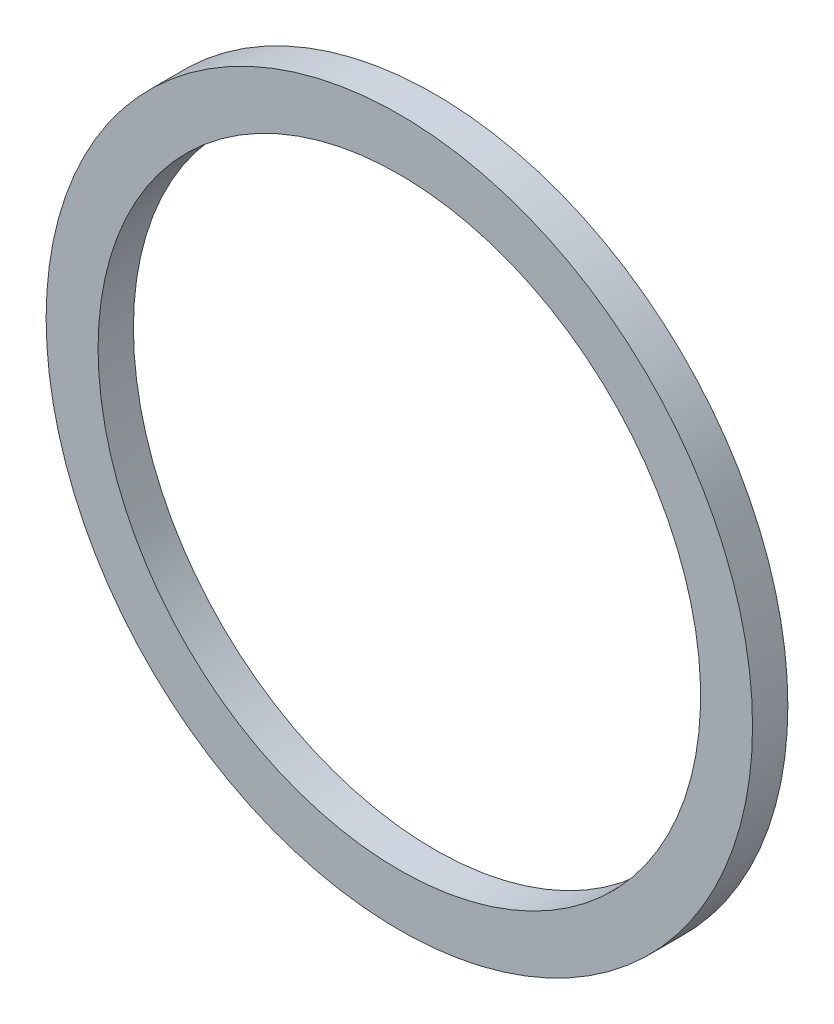
ISO-10303-21;
HEADER;
FILE_DESCRIPTION(('STEP AP214'),'2;1');
FILE_NAME('part.step','',(''),(''),'','','');
FILE_SCHEMA(('AUTOMOTIVE_DESIGN { 1 0 10303 214 1 1 1 1 }'));
ENDSEC;
DATA;
#1=APPLICATION_CONTEXT('core data for automotive mechanical design processes');
#2=APPLICATION_PROTOCOL_DEFINITION('international standard','automotive_design',2000,#1);
#3=PRODUCT_CONTEXT('',#1,'mechanical');
#4=PRODUCT('Part','Part','',(#3));
#5=PRODUCT_RELATED_PRODUCT_CATEGORY('part','',(#4));
#6=PRODUCT_DEFINITION_FORMATION('','',#4);
#7=PRODUCT_DEFINITION_CONTEXT('part definition',#1,'design');
#8=PRODUCT_DEFINITION('design','',#6,#7);
#9=PRODUCT_DEFINITION_SHAPE('','',#8);
#10=(LENGTH_UNIT() NAMED_UNIT(*) SI_UNIT(.MILLI.,.METRE.));
#11=(NAMED_UNIT(*) PLANE_ANGLE_UNIT() SI_UNIT($,.RADIAN.));
#12=(NAMED_UNIT(*) SI_UNIT($,.STERADIAN.) SOLID_ANGLE_UNIT());
#13=UNCERTAINTY_MEASURE_WITH_UNIT(LENGTH_MEASURE(1.E-05),#10,'distance_accuracy_value','');
#14=(GEOMETRIC_REPRESENTATION_CONTEXT(3) GLOBAL_UNCERTAINTY_ASSIGNED_CONTEXT((#13)) GLOBAL_UNIT_ASSIGNED_CONTEXT((#10,
#11,#12)) REPRESENTATION_CONTEXT('',''));
#15=CARTESIAN_POINT('',(0.,0.,0.));
#16=DIRECTION('',(0.,0.,1.));
#17=DIRECTION('',(1.,0.,0.));
#18=AXIS2_PLACEMENT_3D('',#15,#16,#17);
#19=CARTESIAN_POINT('',(0.,0.,3.39999999999996));
#20=DIRECTION('',(0.,0.,0.999999999999999));
#21=DIRECTION('',(1.,0.,0.));
#22=AXIS2_PLACEMENT_3D('',#19,#20,#21);
#23=PLANE('',#22);
#24=CARTESIAN_POINT('',(0.,0.,3.39999999999996));
#25=DIRECTION('',(0.,0.,0.999999999999999));
#26=DIRECTION('',(1.,0.,0.));
#27=AXIS2_PLACEMENT_3D('',#24,#25,#26);
#28=CIRCLE('',#27,34.);
#29=CARTESIAN_POINT('',(-34.,0.,3.39999999999996));
#30=VERTEX_POINT('',#29);
#31=EDGE_CURVE('E10',#30,#30,#28,.T.);
#32=ORIENTED_EDGE('',*,*,#31,.T.);
#33=EDGE_LOOP('',(#32));
#34=FACE_BOUND('',#33,.T.);
#35=CARTESIAN_POINT('',(0.,0.,3.39999999999996));
#36=DIRECTION('',(0.,0.,0.999999999999999));
#37=DIRECTION('',(1.,0.,0.));
#38=AXIS2_PLACEMENT_3D('',#35,#36,#37);
#39=CIRCLE('',#38,29.);
#40=CARTESIAN_POINT('',(-29.,0.,3.39999999999996));
#41=VERTEX_POINT('',#40);
#42=EDGE_CURVE('E43',#41,#41,#39,.T.);
#43=ORIENTED_EDGE('',*,*,#42,.F.);
#44=EDGE_LOOP('',(#43));
#45=FACE_BOUND('',#44,.T.);
#46=ADVANCED_FACE('F32',(#34,#45),#23,.T.);
#47=CARTESIAN_POINT('',(0.,0.,0.));
#48=DIRECTION('',(0.,0.,0.999999999999999));
#49=DIRECTION('',(1.,0.,0.));
#50=AXIS2_PLACEMENT_3D('',#47,#48,#49);
#51=PLANE('',#50);
#52=CARTESIAN_POINT('',(0.,0.,0.));
#53=DIRECTION('',(0.,0.,0.999999999999999));
#54=DIRECTION('',(1.,0.,0.));
#55=AXIS2_PLACEMENT_3D('',#52,#53,#54);
#56=CIRCLE('',#55,34.);
#57=CARTESIAN_POINT('',(-34.,0.,0.));
#58=VERTEX_POINT('',#57);
#59=EDGE_CURVE('E36',#58,#58,#56,.T.);
#60=ORIENTED_EDGE('',*,*,#59,.F.);
#61=EDGE_LOOP('',(#60));
#62=FACE_BOUND('',#61,.T.);
#63=CARTESIAN_POINT('',(0.,0.,0.));
#64=DIRECTION('',(0.,0.,0.999999999999999));
#65=DIRECTION('',(1.,0.,0.));
#66=AXIS2_PLACEMENT_3D('',#63,#64,#65);
#67=CIRCLE('',#66,29.);
#68=CARTESIAN_POINT('',(-29.,0.,0.));
#69=VERTEX_POINT('',#68);
#70=EDGE_CURVE('E45',#69,#69,#67,.T.);
#71=ORIENTED_EDGE('',*,*,#70,.T.);
#72=EDGE_LOOP('',(#71));
#73=FACE_BOUND('',#72,.T.);
#74=ADVANCED_FACE('F55',(#62,#73),#51,.F.);
#75=CARTESIAN_POINT('',(0.,0.,3.39999999999996));
#76=DIRECTION('',(0.,0.,-0.999999999999999));
#77=DIRECTION('',(-1.,0.,0.));
#78=AXIS2_PLACEMENT_3D('',#75,#76,#77);
#79=CYLINDRICAL_SURFACE('',#78,34.);
#80=CARTESIAN_POINT('',(-34.,0.,3.39999999999996));
#81=CARTESIAN_POINT('',(-34.,0.,3.36458333333329));
#82=CARTESIAN_POINT('',(-34.,0.,3.32916666666663));
#83=CARTESIAN_POINT('',(-34.,0.,3.25833333333329));
#84=CARTESIAN_POINT('',(-34.,0.,3.22291666666663));
#85=CARTESIAN_POINT('',(-34.,0.,3.15208333333329));
#86=CARTESIAN_POINT('',(-34.,0.,3.11666666666663));
#87=CARTESIAN_POINT('',(-34.,0.,3.0458333333333));
#88=CARTESIAN_POINT('',(-34.,0.,3.01041666666663));
#89=CARTESIAN_POINT('',(-34.,0.,2.9395833333333));
#90=CARTESIAN_POINT('',(-34.,0.,2.90416666666663));
#91=CARTESIAN_POINT('',(-34.,0.,2.8333333333333));
#92=CARTESIAN_POINT('',(-34.,0.,2.79791666666663));
#93=CARTESIAN_POINT('',(-34.,0.,2.7270833333333));
#94=CARTESIAN_POINT('',(-34.,0.,2.69166666666663));
#95=CARTESIAN_POINT('',(-34.,0.,2.6208333333333));
#96=CARTESIAN_POINT('',(-34.,0.,2.58541666666664));
#97=CARTESIAN_POINT('',(-34.,0.,2.5145833333333));
#98=CARTESIAN_POINT('',(-34.,0.,2.47916666666664));
#99=CARTESIAN_POINT('',(-34.,0.,2.4083333333333));
#100=CARTESIAN_POINT('',(-34.,0.,2.37291666666664));
#101=CARTESIAN_POINT('',(-34.,0.,2.30208333333331));
#102=CARTESIAN_POINT('',(-34.,0.,2.26666666666664));
#103=CARTESIAN_POINT('',(-34.,0.,2.19583333333331));
#104=CARTESIAN_POINT('',(-34.,0.,2.16041666666664));
#105=CARTESIAN_POINT('',(-34.,0.,2.08958333333331));
#106=CARTESIAN_POINT('',(-34.,0.,2.05416666666664));
#107=CARTESIAN_POINT('',(-34.,0.,1.98333333333331));
#108=CARTESIAN_POINT('',(-34.,0.,1.94791666666664));
#109=CARTESIAN_POINT('',(-34.,0.,1.87708333333331));
#110=CARTESIAN_POINT('',(-34.,0.,1.84166666666664));
#111=CARTESIAN_POINT('',(-34.,0.,1.77083333333331));
#112=CARTESIAN_POINT('',(-34.,0.,1.73541666666665));
#113=CARTESIAN_POINT('',(-34.,0.,1.66458333333331));
#114=CARTESIAN_POINT('',(-34.,0.,1.62916666666665));
#115=CARTESIAN_POINT('',(-34.,0.,1.55833333333331));
#116=CARTESIAN_POINT('',(-34.,0.,1.52291666666665));
#117=CARTESIAN_POINT('',(-34.,0.,1.45208333333332));
#118=CARTESIAN_POINT('',(-34.,0.,1.41666666666665));
#119=CARTESIAN_POINT('',(-34.,0.,1.34583333333332));
#120=CARTESIAN_POINT('',(-34.,0.,1.31041666666665));
#121=CARTESIAN_POINT('',(-34.,0.,1.23958333333332));
#122=CARTESIAN_POINT('',(-34.,0.,1.20416666666665));
#123=CARTESIAN_POINT('',(-34.,0.,1.13333333333332));
#124=CARTESIAN_POINT('',(-34.,0.,1.09791666666665));
#125=CARTESIAN_POINT('',(-34.,0.,1.02708333333332));
#126=CARTESIAN_POINT('',(-34.,0.,0.991666666666655));
#127=CARTESIAN_POINT('',(-34.,0.,0.920833333333323));
#128=CARTESIAN_POINT('',(-34.,0.,0.885416666666656));
#129=CARTESIAN_POINT('',(-34.,0.,0.814583333333324));
#130=CARTESIAN_POINT('',(-34.,0.,0.779166666666658));
#131=CARTESIAN_POINT('',(-34.,0.,0.708333333333325));
#132=CARTESIAN_POINT('',(-34.,0.,0.672916666666659));
#133=CARTESIAN_POINT('',(-34.,0.,0.602083333333326));
#134=CARTESIAN_POINT('',(-34.,0.,0.56666666666666));
#135=CARTESIAN_POINT('',(-34.,0.,0.495833333333328));
#136=CARTESIAN_POINT('',(-34.,0.,0.460416666666661));
#137=CARTESIAN_POINT('',(-34.,0.,0.389583333333329));
#138=CARTESIAN_POINT('',(-34.,0.,0.354166666666663));
#139=CARTESIAN_POINT('',(-34.,0.,0.28333333333333));
#140=CARTESIAN_POINT('',(-34.,0.,0.247916666666664));
#141=CARTESIAN_POINT('',(-34.,0.,0.177083333333332));
#142=CARTESIAN_POINT('',(-34.,0.,0.141666666666665));
#143=CARTESIAN_POINT('',(-34.,0.,0.0708333333333329));
#144=CARTESIAN_POINT('',(-34.,0.,0.0354166666666667));
#145=CARTESIAN_POINT('',(-34.,0.,0.));
#146=B_SPLINE_CURVE_WITH_KNOTS('',3,(#80,#81,#82,#83,#84,#85,#86,#87,#88,#89,#90,#91,#92,#93,
#94,#95,#96,#97,#98,#99,#100,#101,#102,#103,#104,#105,#106,#107,#108,#109,#110,#111,#112,#113,
#114,#115,#116,#117,#118,#119,#120,#121,#122,#123,#124,#125,#126,#127,#128,#129,#130,#131,#132,
#133,#134,#135,#136,#137,#138,#139,#140,#141,#142,#143,#144,#145),.UNSPECIFIED.,.F.,.F.,(4,2,2,
2,2,2,2,2,2,2,2,2,2,2,2,2,2,2,2,2,2,2,2,2,2,2,2,2,2,2,2,2,4),(0.,0.106249999999999,
0.212499999999998,0.318749999999997,0.424999999999995,0.531249999999994,0.637499999999993,
0.743749999999991,0.84999999999999,0.956249999999989,1.06249999999999,1.16874999999999,
1.27499999999998,1.38124999999998,1.48749999999998,1.59374999999998,1.69999999999998,
1.80624999999998,1.91249999999998,2.01874999999998,2.12499999999997,2.23124999999997,
2.33749999999997,2.44374999999997,2.54999999999997,2.65624999999997,2.76249999999997,
2.86874999999997,2.97499999999996,3.08124999999996,3.18749999999996,3.29374999999996,
3.39999999999996),.UNSPECIFIED.);
#147=EDGE_CURVE('BSEAM34',#30,#58,#146,.T.);
#148=ORIENTED_EDGE('',*,*,#31,.F.);
#149=ORIENTED_EDGE('',*,*,#59,.T.);
#150=ORIENTED_EDGE('',*,*,#147,.T.);
#151=ORIENTED_EDGE('',*,*,#147,.F.);
#152=EDGE_LOOP('',(#148,#150,#149,#151));
#153=FACE_BOUND('',#152,.T.);
#154=ADVANCED_FACE('F34',(#153),#79,.T.);
#155=CARTESIAN_POINT('',(0.,0.,3.39999999999996));
#156=DIRECTION('',(0.,0.,-0.999999999999999));
#157=DIRECTION('',(-1.,0.,0.));
#158=AXIS2_PLACEMENT_3D('',#155,#156,#157);
#159=CYLINDRICAL_SURFACE('',#158,29.);
#160=CARTESIAN_POINT('',(-29.,0.,3.39999999999996));
#161=CARTESIAN_POINT('',(-29.,0.,3.36458333333329));
#162=CARTESIAN_POINT('',(-29.,0.,3.32916666666663));
#163=CARTESIAN_POINT('',(-29.,0.,3.25833333333329));
#164=CARTESIAN_POINT('',(-29.,0.,3.22291666666663));
#165=CARTESIAN_POINT('',(-29.,0.,3.15208333333329));
#166=CARTESIAN_POINT('',(-29.,0.,3.11666666666663));
#167=CARTESIAN_POINT('',(-29.,0.,3.0458333333333));
#168=CARTESIAN_POINT('',(-29.,0.,3.01041666666663));
#169=CARTESIAN_POINT('',(-29.,0.,2.9395833333333));
#170=CARTESIAN_POINT('',(-29.,0.,2.90416666666663));
#171=CARTESIAN_POINT('',(-29.,0.,2.8333333333333));
#172=CARTESIAN_POINT('',(-29.,0.,2.79791666666663));
#173=CARTESIAN_POINT('',(-29.,0.,2.7270833333333));
#174=CARTESIAN_POINT('',(-29.,0.,2.69166666666663));
#175=CARTESIAN_POINT('',(-29.,0.,2.6208333333333));
#176=CARTESIAN_POINT('',(-29.,0.,2.58541666666664));
#177=CARTESIAN_POINT('',(-29.,0.,2.5145833333333));
#178=CARTESIAN_POINT('',(-29.,0.,2.47916666666664));
#179=CARTESIAN_POINT('',(-29.,0.,2.4083333333333));
#180=CARTESIAN_POINT('',(-29.,0.,2.37291666666664));
#181=CARTESIAN_POINT('',(-29.,0.,2.30208333333331));
#182=CARTESIAN_POINT('',(-29.,0.,2.26666666666664));
#183=CARTESIAN_POINT('',(-29.,0.,2.19583333333331));
#184=CARTESIAN_POINT('',(-29.,0.,2.16041666666664));
#185=CARTESIAN_POINT('',(-29.,0.,2.08958333333331));
#186=CARTESIAN_POINT('',(-29.,0.,2.05416666666664));
#187=CARTESIAN_POINT('',(-29.,0.,1.98333333333331));
#188=CARTESIAN_POINT('',(-29.,0.,1.94791666666664));
#189=CARTESIAN_POINT('',(-29.,0.,1.87708333333331));
#190=CARTESIAN_POINT('',(-29.,0.,1.84166666666664));
#191=CARTESIAN_POINT('',(-29.,0.,1.77083333333331));
#192=CARTESIAN_POINT('',(-29.,0.,1.73541666666665));
#193=CARTESIAN_POINT('',(-29.,0.,1.66458333333331));
#194=CARTESIAN_POINT('',(-29.,0.,1.62916666666665));
#195=CARTESIAN_POINT('',(-29.,0.,1.55833333333331));
#196=CARTESIAN_POINT('',(-29.,0.,1.52291666666665));
#197=CARTESIAN_POINT('',(-29.,0.,1.45208333333332));
#198=CARTESIAN_POINT('',(-29.,0.,1.41666666666665));
#199=CARTESIAN_POINT('',(-29.,0.,1.34583333333332));
#200=CARTESIAN_POINT('',(-29.,0.,1.31041666666665));
#201=CARTESIAN_POINT('',(-29.,0.,1.23958333333332));
#202=CARTESIAN_POINT('',(-29.,0.,1.20416666666665));
#203=CARTESIAN_POINT('',(-29.,0.,1.13333333333332));
#204=CARTESIAN_POINT('',(-29.,0.,1.09791666666665));
#205=CARTESIAN_POINT('',(-29.,0.,1.02708333333332));
#206=CARTESIAN_POINT('',(-29.,0.,0.991666666666655));
#207=CARTESIAN_POINT('',(-29.,0.,0.920833333333323));
#208=CARTESIAN_POINT('',(-29.,0.,0.885416666666656));
#209=CARTESIAN_POINT('',(-29.,0.,0.814583333333324));
#210=CARTESIAN_POINT('',(-29.,0.,0.779166666666658));
#211=CARTESIAN_POINT('',(-29.,0.,0.708333333333325));
#212=CARTESIAN_POINT('',(-29.,0.,0.672916666666659));
#213=CARTESIAN_POINT('',(-29.,0.,0.602083333333326));
#214=CARTESIAN_POINT('',(-29.,0.,0.56666666666666));
#215=CARTESIAN_POINT('',(-29.,0.,0.495833333333328));
#216=CARTESIAN_POINT('',(-29.,0.,0.460416666666661));
#217=CARTESIAN_POINT('',(-29.,0.,0.389583333333329));
#218=CARTESIAN_POINT('',(-29.,0.,0.354166666666663));
#219=CARTESIAN_POINT('',(-29.,0.,0.28333333333333));
#220=CARTESIAN_POINT('',(-29.,0.,0.247916666666664));
#221=CARTESIAN_POINT('',(-29.,0.,0.177083333333332));
#222=CARTESIAN_POINT('',(-29.,0.,0.141666666666665));
#223=CARTESIAN_POINT('',(-29.,0.,0.0708333333333329));
#224=CARTESIAN_POINT('',(-29.,0.,0.0354166666666667));
#225=CARTESIAN_POINT('',(-29.,0.,0.));
#226=B_SPLINE_CURVE_WITH_KNOTS('',3,(#160,#161,#162,#163,#164,#165,#166,#167,#168,#169,#170,
#171,#172,#173,#174,#175,#176,#177,#178,#179,#180,#181,#182,#183,#184,#185,#186,#187,#188,#189,
#190,#191,#192,#193,#194,#195,#196,#197,#198,#199,#200,#201,#202,#203,#204,#205,#206,#207,#208,
#209,#210,#211,#212,#213,#214,#215,#216,#217,#218,#219,#220,#221,#222,#223,#224,#225),
.UNSPECIFIED.,.F.,.F.,(4,2,2,2,2,2,2,2,2,2,2,2,2,2,2,2,2,2,2,2,2,2,2,2,2,2,2,2,2,2,2,2,4),(0.,
0.106249999999999,0.212499999999998,0.318749999999997,0.424999999999995,0.531249999999994,
0.637499999999993,0.743749999999991,0.84999999999999,0.956249999999989,1.06249999999999,
1.16874999999999,1.27499999999998,1.38124999999998,1.48749999999998,1.59374999999998,
1.69999999999998,1.80624999999998,1.91249999999998,2.01874999999998,2.12499999999997,
2.23124999999997,2.33749999999997,2.44374999999997,2.54999999999997,2.65624999999997,
2.76249999999997,2.86874999999997,2.97499999999996,3.08124999999996,3.18749999999996,
3.29374999999996,3.39999999999996),.UNSPECIFIED.);
#227=EDGE_CURVE('BSEAM51',#41,#69,#226,.T.);
#228=ORIENTED_EDGE('',*,*,#42,.T.);
#229=ORIENTED_EDGE('',*,*,#70,.F.);
#230=ORIENTED_EDGE('',*,*,#227,.T.);
#231=ORIENTED_EDGE('',*,*,#227,.F.);
#232=EDGE_LOOP('',(#228,#230,#229,#231));
#233=FACE_BOUND('',#232,.T.);
#234=ADVANCED_FACE('F51',(#233),#159,.F.);
#235=CLOSED_SHELL('',(#46,#74,#154,#234));
#236=MANIFOLD_SOLID_BREP('B2',#235);
#237=ADVANCED_BREP_SHAPE_REPRESENTATION('',(#18,#236),#14);
#238=SHAPE_DEFINITION_REPRESENTATION(#9,#237);
ENDSEC;
END-ISO-10303-21;
